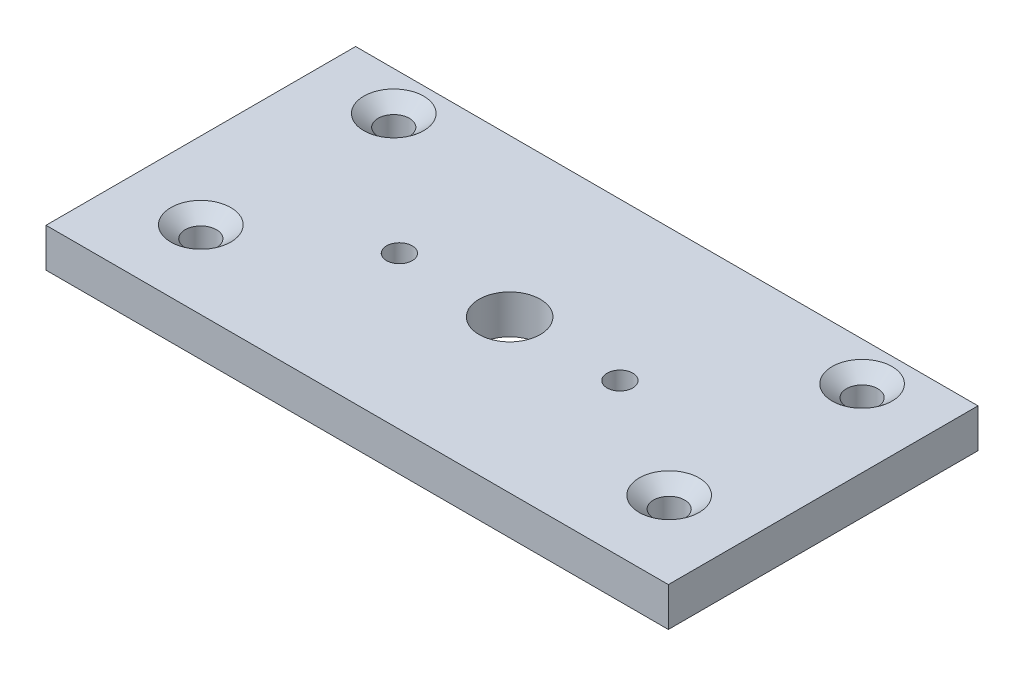
ISO-10303-21;
HEADER;
FILE_DESCRIPTION(('STEP AP214'),'2;1');
FILE_NAME('part.step','',(''),(''),'','','');
FILE_SCHEMA(('AUTOMOTIVE_DESIGN { 1 0 10303 214 1 1 1 1 }'));
ENDSEC;
DATA;
#1=APPLICATION_CONTEXT('core data for automotive mechanical design processes');
#2=APPLICATION_PROTOCOL_DEFINITION('international standard','automotive_design',2000,#1);
#3=PRODUCT_CONTEXT('',#1,'mechanical');
#4=PRODUCT('Part','Part','',(#3));
#5=PRODUCT_RELATED_PRODUCT_CATEGORY('part','',(#4));
#6=PRODUCT_DEFINITION_FORMATION('','',#4);
#7=PRODUCT_DEFINITION_CONTEXT('part definition',#1,'design');
#8=PRODUCT_DEFINITION('design','',#6,#7);
#9=PRODUCT_DEFINITION_SHAPE('','',#8);
#10=(LENGTH_UNIT() NAMED_UNIT(*) SI_UNIT(.MILLI.,.METRE.));
#11=(NAMED_UNIT(*) PLANE_ANGLE_UNIT() SI_UNIT($,.RADIAN.));
#12=(NAMED_UNIT(*) SI_UNIT($,.STERADIAN.) SOLID_ANGLE_UNIT());
#13=UNCERTAINTY_MEASURE_WITH_UNIT(LENGTH_MEASURE(1.E-05),#10,'distance_accuracy_value','');
#14=(GEOMETRIC_REPRESENTATION_CONTEXT(3) GLOBAL_UNCERTAINTY_ASSIGNED_CONTEXT((#13)) GLOBAL_UNIT_ASSIGNED_CONTEXT((#10,
#11,#12)) REPRESENTATION_CONTEXT('',''));
#15=CARTESIAN_POINT('',(0.,0.,0.));
#16=DIRECTION('',(0.,0.,1.));
#17=DIRECTION('',(1.,0.,0.));
#18=AXIS2_PLACEMENT_3D('',#15,#16,#17);
#19=CARTESIAN_POINT('',(0.,6.35,0.));
#20=DIRECTION('',(1.,0.,0.));
#21=DIRECTION('',(0.,0.,-1.));
#22=AXIS2_PLACEMENT_3D('',#19,#20,#21);
#23=PLANE('',#22);
#24=DIRECTION('',(0.,0.,1.));
#25=VECTOR('',#24,1.);
#26=CARTESIAN_POINT('',(0.,0.,0.));
#27=LINE('',#26,#25);
#28=CARTESIAN_POINT('',(0.,0.,-50.546));
#29=VERTEX_POINT('',#28);
#30=CARTESIAN_POINT('',(0.,0.,0.));
#31=VERTEX_POINT('',#30);
#32=EDGE_CURVE('E98',#29,#31,#27,.T.);
#33=ORIENTED_EDGE('',*,*,#32,.T.);
#34=DIRECTION('',(0.,-1.,0.));
#35=VECTOR('',#34,1.);
#36=CARTESIAN_POINT('',(0.,6.35,0.));
#37=LINE('',#36,#35);
#38=CARTESIAN_POINT('',(0.,6.35,0.));
#39=VERTEX_POINT('',#38);
#40=EDGE_CURVE('E11',#39,#31,#37,.T.);
#41=ORIENTED_EDGE('',*,*,#40,.F.);
#42=DIRECTION('',(0.,0.,1.));
#43=VECTOR('',#42,1.);
#44=CARTESIAN_POINT('',(0.,6.35,0.));
#45=LINE('',#44,#43);
#46=CARTESIAN_POINT('',(0.,6.35,-50.546));
#47=VERTEX_POINT('',#46);
#48=EDGE_CURVE('E86',#47,#39,#45,.T.);
#49=ORIENTED_EDGE('',*,*,#48,.F.);
#50=DIRECTION('',(0.,-1.,0.));
#51=VECTOR('',#50,1.);
#52=CARTESIAN_POINT('',(0.,6.35,-50.546));
#53=LINE('',#52,#51);
#54=EDGE_CURVE('E94',#47,#29,#53,.T.);
#55=ORIENTED_EDGE('',*,*,#54,.T.);
#56=EDGE_LOOP('',(#33,#41,#49,#55));
#57=FACE_BOUND('',#56,.T.);
#58=ADVANCED_FACE('F35',(#57),#23,.F.);
#59=CARTESIAN_POINT('',(0.,6.35,0.));
#60=DIRECTION('',(0.,0.,-1.));
#61=DIRECTION('',(-1.,0.,0.));
#62=AXIS2_PLACEMENT_3D('',#59,#60,#61);
#63=PLANE('',#62);
#64=DIRECTION('',(1.,0.,0.));
#65=VECTOR('',#64,1.);
#66=CARTESIAN_POINT('',(0.,0.,0.));
#67=LINE('',#66,#65);
#68=CARTESIAN_POINT('',(101.6,0.,0.));
#69=VERTEX_POINT('',#68);
#70=EDGE_CURVE('E90',#31,#69,#67,.T.);
#71=ORIENTED_EDGE('',*,*,#70,.T.);
#72=DIRECTION('',(0.,-1.,0.));
#73=VECTOR('',#72,1.);
#74=CARTESIAN_POINT('',(101.6,6.35,0.));
#75=LINE('',#74,#73);
#76=CARTESIAN_POINT('',(101.6,6.35,0.));
#77=VERTEX_POINT('',#76);
#78=EDGE_CURVE('E43',#77,#69,#75,.T.);
#79=ORIENTED_EDGE('',*,*,#78,.F.);
#80=DIRECTION('',(1.,0.,0.));
#81=VECTOR('',#80,1.);
#82=CARTESIAN_POINT('',(0.,6.35,0.));
#83=LINE('',#82,#81);
#84=EDGE_CURVE('E81',#39,#77,#83,.T.);
#85=ORIENTED_EDGE('',*,*,#84,.F.);
#86=ORIENTED_EDGE('',*,*,#40,.T.);
#87=EDGE_LOOP('',(#71,#79,#85,#86));
#88=FACE_BOUND('',#87,.T.);
#89=ADVANCED_FACE('F89',(#88),#63,.F.);
#90=CARTESIAN_POINT('',(101.6,6.35,0.));
#91=DIRECTION('',(-1.,0.,0.));
#92=DIRECTION('',(0.,0.,1.));
#93=AXIS2_PLACEMENT_3D('',#90,#91,#92);
#94=PLANE('',#93);
#95=DIRECTION('',(0.,0.,-1.));
#96=VECTOR('',#95,1.);
#97=CARTESIAN_POINT('',(101.6,0.,0.));
#98=LINE('',#97,#96);
#99=CARTESIAN_POINT('',(101.6,0.,-50.546));
#100=VERTEX_POINT('',#99);
#101=EDGE_CURVE('E68',#69,#100,#98,.T.);
#102=ORIENTED_EDGE('',*,*,#101,.T.);
#103=DIRECTION('',(0.,-1.,0.));
#104=VECTOR('',#103,1.);
#105=CARTESIAN_POINT('',(101.6,6.35,-50.546));
#106=LINE('',#105,#104);
#107=CARTESIAN_POINT('',(101.6,6.35,-50.546));
#108=VERTEX_POINT('',#107);
#109=EDGE_CURVE('E91',#108,#100,#106,.T.);
#110=ORIENTED_EDGE('',*,*,#109,.F.);
#111=DIRECTION('',(0.,0.,-1.));
#112=VECTOR('',#111,1.);
#113=CARTESIAN_POINT('',(101.6,6.35,0.));
#114=LINE('',#113,#112);
#115=EDGE_CURVE('E84',#77,#108,#114,.T.);
#116=ORIENTED_EDGE('',*,*,#115,.F.);
#117=ORIENTED_EDGE('',*,*,#78,.T.);
#118=EDGE_LOOP('',(#102,#110,#116,#117));
#119=FACE_BOUND('',#118,.T.);
#120=ADVANCED_FACE('F92',(#119),#94,.F.);
#121=CARTESIAN_POINT('',(0.,6.35,-50.546));
#122=DIRECTION('',(0.,0.,1.));
#123=DIRECTION('',(1.,0.,0.));
#124=AXIS2_PLACEMENT_3D('',#121,#122,#123);
#125=PLANE('',#124);
#126=DIRECTION('',(-1.,0.,0.));
#127=VECTOR('',#126,1.);
#128=CARTESIAN_POINT('',(0.,0.,-50.546));
#129=LINE('',#128,#127);
#130=EDGE_CURVE('E74',#100,#29,#129,.T.);
#131=ORIENTED_EDGE('',*,*,#130,.T.);
#132=ORIENTED_EDGE('',*,*,#54,.F.);
#133=DIRECTION('',(-1.,0.,0.));
#134=VECTOR('',#133,1.);
#135=CARTESIAN_POINT('',(0.,6.35,-50.546));
#136=LINE('',#135,#134);
#137=EDGE_CURVE('E51',#108,#47,#136,.T.);
#138=ORIENTED_EDGE('',*,*,#137,.F.);
#139=ORIENTED_EDGE('',*,*,#109,.T.);
#140=EDGE_LOOP('',(#131,#132,#138,#139));
#141=FACE_BOUND('',#140,.T.);
#142=ADVANCED_FACE('F106',(#141),#125,.F.);
#143=CARTESIAN_POINT('',(0.,6.35,0.));
#144=DIRECTION('',(0.,-1.,0.));
#145=DIRECTION('',(0.,0.,-1.));
#146=AXIS2_PLACEMENT_3D('',#143,#144,#145);
#147=PLANE('',#146);
#148=CARTESIAN_POINT('',(12.573,6.35,-44.196));
#149=DIRECTION('',(0.,1.,0.));
#150=DIRECTION('',(0.,0.,1.));
#151=AXIS2_PLACEMENT_3D('',#148,#149,#150);
#152=CIRCLE('',#151,4.8895);
#153=CARTESIAN_POINT('',(12.573,6.35,-39.3065));
#154=VERTEX_POINT('',#153);
#155=EDGE_CURVE('E162',#154,#154,#152,.T.);
#156=ORIENTED_EDGE('',*,*,#155,.F.);
#157=EDGE_LOOP('',(#156));
#158=FACE_BOUND('',#157,.T.);
#159=CARTESIAN_POINT('',(89.027,6.35,-12.7));
#160=DIRECTION('',(0.,1.,0.));
#161=DIRECTION('',(0.,0.,1.));
#162=AXIS2_PLACEMENT_3D('',#159,#160,#161);
#163=CIRCLE('',#162,4.88950000000001);
#164=CARTESIAN_POINT('',(89.027,6.35,-7.8105));
#165=VERTEX_POINT('',#164);
#166=EDGE_CURVE('E153',#165,#165,#163,.T.);
#167=ORIENTED_EDGE('',*,*,#166,.F.);
#168=EDGE_LOOP('',(#167));
#169=FACE_BOUND('',#168,.T.);
#170=CARTESIAN_POINT('',(12.573,6.35,-12.7));
#171=DIRECTION('',(0.,1.,0.));
#172=DIRECTION('',(0.,0.,1.));
#173=AXIS2_PLACEMENT_3D('',#170,#171,#172);
#174=CIRCLE('',#173,4.8895);
#175=CARTESIAN_POINT('',(12.573,6.35,-7.8105));
#176=VERTEX_POINT('',#175);
#177=EDGE_CURVE('E144',#176,#176,#174,.T.);
#178=ORIENTED_EDGE('',*,*,#177,.F.);
#179=EDGE_LOOP('',(#178));
#180=FACE_BOUND('',#179,.T.);
#181=CARTESIAN_POINT('',(89.027,6.35,-44.196));
#182=DIRECTION('',(0.,1.,0.));
#183=DIRECTION('',(0.,0.,1.));
#184=AXIS2_PLACEMENT_3D('',#181,#182,#183);
#185=CIRCLE('',#184,4.88950000000001);
#186=CARTESIAN_POINT('',(89.027,6.35,-39.3065));
#187=VERTEX_POINT('',#186);
#188=EDGE_CURVE('E135',#187,#187,#185,.T.);
#189=ORIENTED_EDGE('',*,*,#188,.F.);
#190=EDGE_LOOP('',(#189));
#191=FACE_BOUND('',#190,.T.);
#192=CARTESIAN_POINT('',(50.8,6.35,-24.892));
#193=DIRECTION('',(0.,1.,0.));
#194=DIRECTION('',(0.,0.,1.));
#195=AXIS2_PLACEMENT_3D('',#192,#193,#194);
#196=CIRCLE('',#195,4.99999999999999);
#197=CARTESIAN_POINT('',(50.8,6.35,-19.892));
#198=VERTEX_POINT('',#197);
#199=EDGE_CURVE('E126',#198,#198,#196,.T.);
#200=ORIENTED_EDGE('',*,*,#199,.F.);
#201=EDGE_LOOP('',(#200));
#202=FACE_BOUND('',#201,.T.);
#203=CARTESIAN_POINT('',(32.800036,6.35,-24.892));
#204=DIRECTION('',(0.,1.,0.));
#205=DIRECTION('',(0.,0.,1.));
#206=AXIS2_PLACEMENT_3D('',#203,#204,#205);
#207=CIRCLE('',#206,2.09999999999999);
#208=CARTESIAN_POINT('',(32.800036,6.35,-22.792));
#209=VERTEX_POINT('',#208);
#210=EDGE_CURVE('E120',#209,#209,#207,.T.);
#211=ORIENTED_EDGE('',*,*,#210,.F.);
#212=EDGE_LOOP('',(#211));
#213=FACE_BOUND('',#212,.T.);
#214=CARTESIAN_POINT('',(68.799964,6.35,-24.892));
#215=DIRECTION('',(0.,1.,0.));
#216=DIRECTION('',(0.,0.,1.));
#217=AXIS2_PLACEMENT_3D('',#214,#215,#216);
#218=CIRCLE('',#217,2.09999999999999);
#219=CARTESIAN_POINT('',(68.799964,6.35,-22.792));
#220=VERTEX_POINT('',#219);
#221=EDGE_CURVE('E114',#220,#220,#218,.T.);
#222=ORIENTED_EDGE('',*,*,#221,.F.);
#223=EDGE_LOOP('',(#222));
#224=FACE_BOUND('',#223,.T.);
#225=ORIENTED_EDGE('',*,*,#48,.T.);
#226=ORIENTED_EDGE('',*,*,#84,.T.);
#227=ORIENTED_EDGE('',*,*,#115,.T.);
#228=ORIENTED_EDGE('',*,*,#137,.T.);
#229=EDGE_LOOP('',(#225,#226,#227,#228));
#230=FACE_BOUND('',#229,.T.);
#231=ADVANCED_FACE('F82',(#158,#169,#180,#191,#202,#213,#224,#230),#147,.F.);
#232=CARTESIAN_POINT('',(0.,0.,0.));
#233=DIRECTION('',(0.,-1.,0.));
#234=DIRECTION('',(0.,0.,-1.));
#235=AXIS2_PLACEMENT_3D('',#232,#233,#234);
#236=PLANE('',#235);
#237=CARTESIAN_POINT('',(12.573,0.,-44.196));
#238=DIRECTION('',(0.,1.,0.));
#239=DIRECTION('',(0.,0.,1.));
#240=AXIS2_PLACEMENT_3D('',#237,#238,#239);
#241=CIRCLE('',#240,2.55269999999999);
#242=CARTESIAN_POINT('',(12.573,0.,-41.6433));
#243=VERTEX_POINT('',#242);
#244=EDGE_CURVE('E156',#243,#243,#241,.T.);
#245=ORIENTED_EDGE('',*,*,#244,.T.);
#246=EDGE_LOOP('',(#245));
#247=FACE_BOUND('',#246,.T.);
#248=CARTESIAN_POINT('',(89.027,0.,-12.7));
#249=DIRECTION('',(0.,1.,0.));
#250=DIRECTION('',(0.,0.,1.));
#251=AXIS2_PLACEMENT_3D('',#248,#249,#250);
#252=CIRCLE('',#251,2.55269999999999);
#253=CARTESIAN_POINT('',(89.027,0.,-10.1473));
#254=VERTEX_POINT('',#253);
#255=EDGE_CURVE('E147',#254,#254,#252,.T.);
#256=ORIENTED_EDGE('',*,*,#255,.T.);
#257=EDGE_LOOP('',(#256));
#258=FACE_BOUND('',#257,.T.);
#259=CARTESIAN_POINT('',(12.573,0.,-12.7));
#260=DIRECTION('',(0.,1.,0.));
#261=DIRECTION('',(0.,0.,1.));
#262=AXIS2_PLACEMENT_3D('',#259,#260,#261);
#263=CIRCLE('',#262,2.55269999999999);
#264=CARTESIAN_POINT('',(12.573,0.,-10.1473));
#265=VERTEX_POINT('',#264);
#266=EDGE_CURVE('E138',#265,#265,#263,.T.);
#267=ORIENTED_EDGE('',*,*,#266,.T.);
#268=EDGE_LOOP('',(#267));
#269=FACE_BOUND('',#268,.T.);
#270=CARTESIAN_POINT('',(89.027,0.,-44.196));
#271=DIRECTION('',(0.,1.,0.));
#272=DIRECTION('',(0.,0.,1.));
#273=AXIS2_PLACEMENT_3D('',#270,#271,#272);
#274=CIRCLE('',#273,2.55269999999999);
#275=CARTESIAN_POINT('',(89.027,0.,-41.6433));
#276=VERTEX_POINT('',#275);
#277=EDGE_CURVE('E129',#276,#276,#274,.T.);
#278=ORIENTED_EDGE('',*,*,#277,.T.);
#279=EDGE_LOOP('',(#278));
#280=FACE_BOUND('',#279,.T.);
#281=CARTESIAN_POINT('',(50.8,0.,-24.892));
#282=DIRECTION('',(0.,1.,0.));
#283=DIRECTION('',(0.,0.,1.));
#284=AXIS2_PLACEMENT_3D('',#281,#282,#283);
#285=CIRCLE('',#284,5.);
#286=CARTESIAN_POINT('',(50.8,0.,-19.892));
#287=VERTEX_POINT('',#286);
#288=EDGE_CURVE('E123',#287,#287,#285,.T.);
#289=ORIENTED_EDGE('',*,*,#288,.T.);
#290=EDGE_LOOP('',(#289));
#291=FACE_BOUND('',#290,.T.);
#292=CARTESIAN_POINT('',(32.800036,0.,-24.892));
#293=DIRECTION('',(0.,1.,0.));
#294=DIRECTION('',(0.,0.,1.));
#295=AXIS2_PLACEMENT_3D('',#292,#293,#294);
#296=CIRCLE('',#295,2.1);
#297=CARTESIAN_POINT('',(32.800036,0.,-22.792));
#298=VERTEX_POINT('',#297);
#299=EDGE_CURVE('E117',#298,#298,#296,.T.);
#300=ORIENTED_EDGE('',*,*,#299,.T.);
#301=EDGE_LOOP('',(#300));
#302=FACE_BOUND('',#301,.T.);
#303=CARTESIAN_POINT('',(68.799964,0.,-24.892));
#304=DIRECTION('',(0.,1.,0.));
#305=DIRECTION('',(0.,0.,1.));
#306=AXIS2_PLACEMENT_3D('',#303,#304,#305);
#307=CIRCLE('',#306,2.1);
#308=CARTESIAN_POINT('',(68.799964,0.,-22.792));
#309=VERTEX_POINT('',#308);
#310=EDGE_CURVE('E101',#309,#309,#307,.T.);
#311=ORIENTED_EDGE('',*,*,#310,.T.);
#312=EDGE_LOOP('',(#311));
#313=FACE_BOUND('',#312,.T.);
#314=ORIENTED_EDGE('',*,*,#32,.F.);
#315=ORIENTED_EDGE('',*,*,#130,.F.);
#316=ORIENTED_EDGE('',*,*,#101,.F.);
#317=ORIENTED_EDGE('',*,*,#70,.F.);
#318=EDGE_LOOP('',(#314,#315,#316,#317));
#319=FACE_BOUND('',#318,.T.);
#320=ADVANCED_FACE('F109',(#247,#258,#269,#280,#291,#302,#313,#319),#236,.T.);
#321=CARTESIAN_POINT('',(68.799964,6.35,-24.892));
#322=DIRECTION('',(0.,1.,0.));
#323=DIRECTION('',(0.,0.,1.));
#324=AXIS2_PLACEMENT_3D('',#321,#322,#323);
#325=CYLINDRICAL_SURFACE('',#324,2.1);
#326=ORIENTED_EDGE('',*,*,#310,.F.);
#327=EDGE_LOOP('',(#326));
#328=FACE_BOUND('',#327,.T.);
#329=ORIENTED_EDGE('',*,*,#221,.T.);
#330=EDGE_LOOP('',(#329));
#331=FACE_BOUND('',#330,.T.);
#332=ADVANCED_FACE('F183',(#328,#331),#325,.F.);
#333=CARTESIAN_POINT('',(32.800036,6.35,-24.892));
#334=DIRECTION('',(0.,1.,0.));
#335=DIRECTION('',(0.,0.,1.));
#336=AXIS2_PLACEMENT_3D('',#333,#334,#335);
#337=CYLINDRICAL_SURFACE('',#336,2.09999999999999);
#338=ORIENTED_EDGE('',*,*,#299,.F.);
#339=EDGE_LOOP('',(#338));
#340=FACE_BOUND('',#339,.T.);
#341=ORIENTED_EDGE('',*,*,#210,.T.);
#342=EDGE_LOOP('',(#341));
#343=FACE_BOUND('',#342,.T.);
#344=ADVANCED_FACE('F185',(#340,#343),#337,.F.);
#345=CARTESIAN_POINT('',(50.8,6.35,-24.892));
#346=DIRECTION('',(0.,1.,0.));
#347=DIRECTION('',(0.,0.,1.));
#348=AXIS2_PLACEMENT_3D('',#345,#346,#347);
#349=CYLINDRICAL_SURFACE('',#348,4.99999999999999);
#350=ORIENTED_EDGE('',*,*,#288,.F.);
#351=EDGE_LOOP('',(#350));
#352=FACE_BOUND('',#351,.T.);
#353=ORIENTED_EDGE('',*,*,#199,.T.);
#354=EDGE_LOOP('',(#353));
#355=FACE_BOUND('',#354,.T.);
#356=ADVANCED_FACE('F192',(#352,#355),#349,.F.);
#357=CARTESIAN_POINT('',(89.027,6.35,-44.196));
#358=DIRECTION('',(0.,1.,0.));
#359=DIRECTION('',(0.,0.,1.));
#360=AXIS2_PLACEMENT_3D('',#357,#358,#359);
#361=CYLINDRICAL_SURFACE('',#360,2.5527);
#362=ORIENTED_EDGE('',*,*,#277,.F.);
#363=EDGE_LOOP('',(#362));
#364=FACE_BOUND('',#363,.T.);
#365=CARTESIAN_POINT('',(89.027,4.38919198186493,-44.196));
#366=DIRECTION('',(0.,1.,0.));
#367=DIRECTION('',(0.,0.,1.));
#368=AXIS2_PLACEMENT_3D('',#365,#366,#367);
#369=CIRCLE('',#368,2.55270000000001);
#370=CARTESIAN_POINT('',(89.027,4.38919198186493,-41.6433));
#371=VERTEX_POINT('',#370);
#372=EDGE_CURVE('E132',#371,#371,#369,.T.);
#373=ORIENTED_EDGE('',*,*,#372,.T.);
#374=EDGE_LOOP('',(#373));
#375=FACE_BOUND('',#374,.T.);
#376=ADVANCED_FACE('F228',(#364,#375),#361,.F.);
#377=CARTESIAN_POINT('',(89.027,6.35,-44.196));
#378=DIRECTION('',(0.,1.,0.));
#379=DIRECTION('',(0.,0.,1.));
#380=AXIS2_PLACEMENT_3D('',#377,#378,#379);
#381=CONICAL_SURFACE('',#380,4.88950000000001,0.872664625997164);
#382=ORIENTED_EDGE('',*,*,#372,.F.);
#383=EDGE_LOOP('',(#382));
#384=FACE_BOUND('',#383,.T.);
#385=ORIENTED_EDGE('',*,*,#188,.T.);
#386=EDGE_LOOP('',(#385));
#387=FACE_BOUND('',#386,.T.);
#388=ADVANCED_FACE('F233',(#384,#387),#381,.F.);
#389=CARTESIAN_POINT('',(12.573,6.35,-12.7));
#390=DIRECTION('',(0.,1.,0.));
#391=DIRECTION('',(0.,0.,1.));
#392=AXIS2_PLACEMENT_3D('',#389,#390,#391);
#393=CYLINDRICAL_SURFACE('',#392,2.55269999999999);
#394=ORIENTED_EDGE('',*,*,#266,.F.);
#395=EDGE_LOOP('',(#394));
#396=FACE_BOUND('',#395,.T.);
#397=CARTESIAN_POINT('',(12.573,4.38919198186493,-12.7));
#398=DIRECTION('',(0.,1.,0.));
#399=DIRECTION('',(0.,0.,1.));
#400=AXIS2_PLACEMENT_3D('',#397,#398,#399);
#401=CIRCLE('',#400,2.5527);
#402=CARTESIAN_POINT('',(12.573,4.38919198186493,-10.1473));
#403=VERTEX_POINT('',#402);
#404=EDGE_CURVE('E141',#403,#403,#401,.T.);
#405=ORIENTED_EDGE('',*,*,#404,.T.);
#406=EDGE_LOOP('',(#405));
#407=FACE_BOUND('',#406,.T.);
#408=ADVANCED_FACE('F245',(#396,#407),#393,.F.);
#409=CARTESIAN_POINT('',(12.573,6.35,-12.7));
#410=DIRECTION('',(0.,1.,0.));
#411=DIRECTION('',(0.,0.,1.));
#412=AXIS2_PLACEMENT_3D('',#409,#410,#411);
#413=CONICAL_SURFACE('',#412,4.8895,0.872664625997164);
#414=ORIENTED_EDGE('',*,*,#404,.F.);
#415=EDGE_LOOP('',(#414));
#416=FACE_BOUND('',#415,.T.);
#417=ORIENTED_EDGE('',*,*,#177,.T.);
#418=EDGE_LOOP('',(#417));
#419=FACE_BOUND('',#418,.T.);
#420=ADVANCED_FACE('F255',(#416,#419),#413,.F.);
#421=CARTESIAN_POINT('',(89.027,6.35,-12.7));
#422=DIRECTION('',(0.,1.,0.));
#423=DIRECTION('',(0.,0.,1.));
#424=AXIS2_PLACEMENT_3D('',#421,#422,#423);
#425=CYLINDRICAL_SURFACE('',#424,2.5527);
#426=ORIENTED_EDGE('',*,*,#255,.F.);
#427=EDGE_LOOP('',(#426));
#428=FACE_BOUND('',#427,.T.);
#429=CARTESIAN_POINT('',(89.027,4.38919198186493,-12.7));
#430=DIRECTION('',(0.,1.,0.));
#431=DIRECTION('',(0.,0.,1.));
#432=AXIS2_PLACEMENT_3D('',#429,#430,#431);
#433=CIRCLE('',#432,2.55270000000001);
#434=CARTESIAN_POINT('',(89.027,4.38919198186493,-10.1473));
#435=VERTEX_POINT('',#434);
#436=EDGE_CURVE('E150',#435,#435,#433,.T.);
#437=ORIENTED_EDGE('',*,*,#436,.T.);
#438=EDGE_LOOP('',(#437));
#439=FACE_BOUND('',#438,.T.);
#440=ADVANCED_FACE('F265',(#428,#439),#425,.F.);
#441=CARTESIAN_POINT('',(89.027,6.35,-12.7));
#442=DIRECTION('',(0.,1.,0.));
#443=DIRECTION('',(0.,0.,1.));
#444=AXIS2_PLACEMENT_3D('',#441,#442,#443);
#445=CONICAL_SURFACE('',#444,4.88950000000001,0.872664625997164);
#446=ORIENTED_EDGE('',*,*,#436,.F.);
#447=EDGE_LOOP('',(#446));
#448=FACE_BOUND('',#447,.T.);
#449=ORIENTED_EDGE('',*,*,#166,.T.);
#450=EDGE_LOOP('',(#449));
#451=FACE_BOUND('',#450,.T.);
#452=ADVANCED_FACE('F275',(#448,#451),#445,.F.);
#453=CARTESIAN_POINT('',(12.573,6.35,-44.196));
#454=DIRECTION('',(0.,1.,0.));
#455=DIRECTION('',(0.,0.,1.));
#456=AXIS2_PLACEMENT_3D('',#453,#454,#455);
#457=CYLINDRICAL_SURFACE('',#456,2.55269999999999);
#458=ORIENTED_EDGE('',*,*,#244,.F.);
#459=EDGE_LOOP('',(#458));
#460=FACE_BOUND('',#459,.T.);
#461=CARTESIAN_POINT('',(12.573,4.38919198186493,-44.196));
#462=DIRECTION('',(0.,1.,0.));
#463=DIRECTION('',(0.,0.,1.));
#464=AXIS2_PLACEMENT_3D('',#461,#462,#463);
#465=CIRCLE('',#464,2.5527);
#466=CARTESIAN_POINT('',(12.573,4.38919198186493,-41.6433));
#467=VERTEX_POINT('',#466);
#468=EDGE_CURVE('E159',#467,#467,#465,.T.);
#469=ORIENTED_EDGE('',*,*,#468,.T.);
#470=EDGE_LOOP('',(#469));
#471=FACE_BOUND('',#470,.T.);
#472=ADVANCED_FACE('F285',(#460,#471),#457,.F.);
#473=CARTESIAN_POINT('',(12.573,6.35,-44.196));
#474=DIRECTION('',(0.,1.,0.));
#475=DIRECTION('',(0.,0.,1.));
#476=AXIS2_PLACEMENT_3D('',#473,#474,#475);
#477=CONICAL_SURFACE('',#476,4.8895,0.872664625997164);
#478=ORIENTED_EDGE('',*,*,#468,.F.);
#479=EDGE_LOOP('',(#478));
#480=FACE_BOUND('',#479,.T.);
#481=ORIENTED_EDGE('',*,*,#155,.T.);
#482=EDGE_LOOP('',(#481));
#483=FACE_BOUND('',#482,.T.);
#484=ADVANCED_FACE('F166',(#480,#483),#477,.F.);
#485=CLOSED_SHELL('',(#58,#89,#120,#142,#231,#320,#332,#344,#356,#376,#388,#408,#420,#440,#452,
#472,#484));
#486=MANIFOLD_SOLID_BREP('B2',#485);
#487=ADVANCED_BREP_SHAPE_REPRESENTATION('',(#18,#486),#14);
#488=SHAPE_DEFINITION_REPRESENTATION(#9,#487);
ENDSEC;
END-ISO-10303-21;
